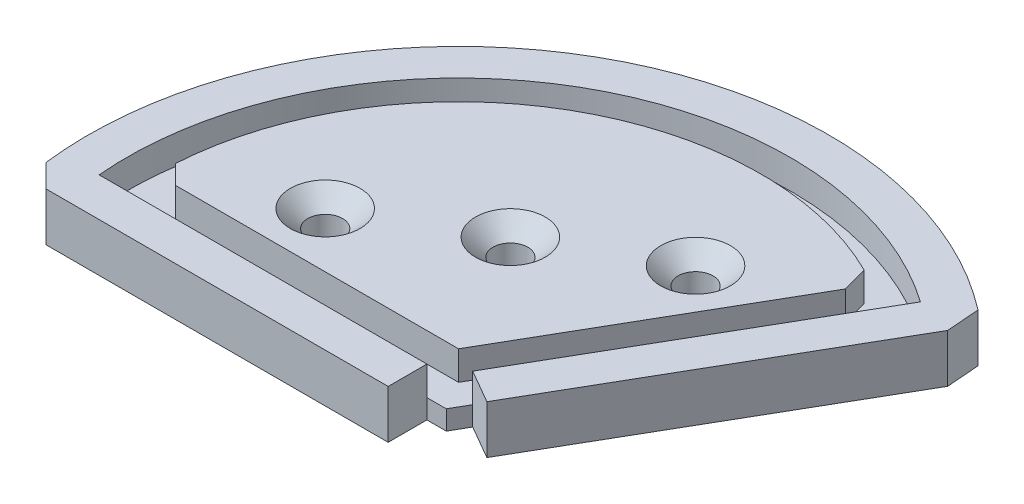
ISO-10303-21;
HEADER;
FILE_DESCRIPTION(('STEP AP214'),'2;1');
FILE_NAME('part.step','',(''),(''),'','','');
FILE_SCHEMA(('AUTOMOTIVE_DESIGN { 1 0 10303 214 1 1 1 1 }'));
ENDSEC;
DATA;
#1=APPLICATION_CONTEXT('core data for automotive mechanical design processes');
#2=APPLICATION_PROTOCOL_DEFINITION('international standard','automotive_design',2000,#1);
#3=PRODUCT_CONTEXT('',#1,'mechanical');
#4=PRODUCT('Part','Part','',(#3));
#5=PRODUCT_RELATED_PRODUCT_CATEGORY('part','',(#4));
#6=PRODUCT_DEFINITION_FORMATION('','',#4);
#7=PRODUCT_DEFINITION_CONTEXT('part definition',#1,'design');
#8=PRODUCT_DEFINITION('design','',#6,#7);
#9=PRODUCT_DEFINITION_SHAPE('','',#8);
#10=(LENGTH_UNIT() NAMED_UNIT(*) SI_UNIT(.MILLI.,.METRE.));
#11=(NAMED_UNIT(*) PLANE_ANGLE_UNIT() SI_UNIT($,.RADIAN.));
#12=(NAMED_UNIT(*) SI_UNIT($,.STERADIAN.) SOLID_ANGLE_UNIT());
#13=UNCERTAINTY_MEASURE_WITH_UNIT(LENGTH_MEASURE(1.E-05),#10,'distance_accuracy_value','');
#14=(GEOMETRIC_REPRESENTATION_CONTEXT(3) GLOBAL_UNCERTAINTY_ASSIGNED_CONTEXT((#13)) GLOBAL_UNIT_ASSIGNED_CONTEXT((#10,
#11,#12)) REPRESENTATION_CONTEXT('',''));
#15=CARTESIAN_POINT('',(0.,0.,0.));
#16=DIRECTION('',(0.,0.,1.));
#17=DIRECTION('',(1.,0.,0.));
#18=AXIS2_PLACEMENT_3D('',#15,#16,#17);
#19=CARTESIAN_POINT('',(0.,-1.,0.));
#20=DIRECTION('',(0.,-1.,0.));
#21=DIRECTION('',(0.,0.,-1.));
#22=AXIS2_PLACEMENT_3D('',#19,#20,#21);
#23=PLANE('',#22);
#24=CARTESIAN_POINT('',(-9.71842782649105,-1.,-2.8328107651737));
#25=DIRECTION('',(0.,-1.,0.));
#26=DIRECTION('',(0.,0.,-1.));
#27=AXIS2_PLACEMENT_3D('',#24,#25,#26);
#28=CIRCLE('',#27,0.899999999999999);
#29=CARTESIAN_POINT('',(-9.71842782649105,-1.,-3.7328107651737));
#30=VERTEX_POINT('',#29);
#31=EDGE_CURVE('E548',#30,#30,#28,.F.);
#32=ORIENTED_EDGE('',*,*,#31,.T.);
#33=EDGE_LOOP('',(#32));
#34=FACE_BOUND('',#33,.T.);
#35=CARTESIAN_POINT('',(-3.65624999999998,-1.,-6.33281076517369));
#36=DIRECTION('',(0.,-1.,0.));
#37=DIRECTION('',(0.,0.,-1.));
#38=AXIS2_PLACEMENT_3D('',#35,#36,#37);
#39=CIRCLE('',#38,0.899999999999999);
#40=CARTESIAN_POINT('',(-3.65624999999998,-1.,-7.23281076517368));
#41=VERTEX_POINT('',#40);
#42=EDGE_CURVE('E227',#41,#41,#39,.F.);
#43=ORIENTED_EDGE('',*,*,#42,.T.);
#44=EDGE_LOOP('',(#43));
#45=FACE_BOUND('',#44,.T.);
#46=CARTESIAN_POINT('',(0.,-1.,0.));
#47=DIRECTION('',(0.,-1.,0.));
#48=DIRECTION('',(0.,0.,-1.));
#49=AXIS2_PLACEMENT_3D('',#46,#47,#48);
#50=CIRCLE('',#49,19.125);
#51=CARTESIAN_POINT('',(-18.9840057931438,-1.,2.31800540247032));
#52=VERTEX_POINT('',#51);
#53=CARTESIAN_POINT('',(11.6749307019114,-1.,-15.1479905632915));
#54=VERTEX_POINT('',#53);
#55=EDGE_CURVE('E298',#52,#54,#50,.T.);
#56=ORIENTED_EDGE('',*,*,#55,.T.);
#57=DIRECTION('',(-0.0776772910663522,0.,-0.996978554660326));
#58=VECTOR('',#57,1.);
#59=CARTESIAN_POINT('',(12.7775866276491,-1.,-0.995536274037095));
#60=LINE('',#59,#58);
#61=CARTESIAN_POINT('',(11.8071766569381,-1.,-13.4506298637579));
#62=VERTEX_POINT('',#61);
#63=EDGE_CURVE('E79',#54,#62,#60,.F.);
#64=ORIENTED_EDGE('',*,*,#63,.T.);
#65=DIRECTION('',(-0.500000000000004,0.,0.866025403784437));
#66=VECTOR('',#65,1.);
#67=CARTESIAN_POINT('',(3.03108891324553,-1.,1.75000000000001));
#68=LINE('',#67,#66);
#69=CARTESIAN_POINT('',(3.09807621135331,-1.,1.63397459621556));
#70=VERTEX_POINT('',#69);
#71=EDGE_CURVE('E301',#62,#70,#68,.T.);
#72=ORIENTED_EDGE('',*,*,#71,.T.);
#73=DIRECTION('',(-0.866025403784439,0.,-0.5));
#74=VECTOR('',#73,1.);
#75=CARTESIAN_POINT('',(1.36602540378443,-1.,0.633974596215562));
#76=LINE('',#75,#74);
#77=CARTESIAN_POINT('',(1.36602540378443,-1.,0.633974596215562));
#78=VERTEX_POINT('',#77);
#79=EDGE_CURVE('E214',#70,#78,#76,.T.);
#80=ORIENTED_EDGE('',*,*,#79,.T.);
#81=DIRECTION('',(-0.5,0.,0.866025403784439));
#82=VECTOR('',#81,1.);
#83=CARTESIAN_POINT('',(0.866025403784433,-1.,1.5));
#84=LINE('',#83,#82);
#85=CARTESIAN_POINT('',(0.866025403784433,-1.,1.5));
#86=VERTEX_POINT('',#85);
#87=EDGE_CURVE('E219',#78,#86,#84,.T.);
#88=ORIENTED_EDGE('',*,*,#87,.T.);
#89=DIRECTION('',(-1.,0.,0.));
#90=VECTOR('',#89,1.);
#91=CARTESIAN_POINT('',(-0.133974596215565,-1.,1.5));
#92=LINE('',#91,#90);
#93=CARTESIAN_POINT('',(-0.133974596215565,-1.,1.5));
#94=VERTEX_POINT('',#93);
#95=EDGE_CURVE('E197',#86,#94,#92,.T.);
#96=ORIENTED_EDGE('',*,*,#95,.T.);
#97=DIRECTION('',(0.,0.,1.));
#98=VECTOR('',#97,1.);
#99=CARTESIAN_POINT('',(-0.133974596215565,-1.,1.5));
#100=LINE('',#99,#98);
#101=CARTESIAN_POINT('',(-0.133974596215565,-1.,3.5));
#102=VERTEX_POINT('',#101);
#103=EDGE_CURVE('E208',#94,#102,#100,.T.);
#104=ORIENTED_EDGE('',*,*,#103,.T.);
#105=DIRECTION('',(-1.,0.,0.));
#106=VECTOR('',#105,1.);
#107=CARTESIAN_POINT('',(0.,-1.,3.5));
#108=LINE('',#107,#106);
#109=CARTESIAN_POINT('',(-17.8020111956141,-1.,3.5));
#110=VERTEX_POINT('',#109);
#111=EDGE_CURVE('E295',#102,#110,#108,.T.);
#112=ORIENTED_EDGE('',*,*,#111,.T.);
#113=DIRECTION('',(0.707106781186549,0.,0.707106781186546));
#114=VECTOR('',#113,1.);
#115=CARTESIAN_POINT('',(-10.651005597807,-1.,10.6510055978071));
#116=LINE('',#115,#114);
#117=EDGE_CURVE('E372',#110,#52,#116,.F.);
#118=ORIENTED_EDGE('',*,*,#117,.T.);
#119=EDGE_LOOP('',(#56,#64,#72,#80,#88,#96,#104,#112,#118));
#120=FACE_BOUND('',#119,.T.);
#121=CARTESIAN_POINT('',(2.40592782649111,-1.,-9.83281076517367));
#122=DIRECTION('',(0.,-1.,0.));
#123=DIRECTION('',(0.,0.,-1.));
#124=AXIS2_PLACEMENT_3D('',#121,#122,#123);
#125=CIRCLE('',#124,0.899999999999999);
#126=CARTESIAN_POINT('',(2.40592782649111,-1.,-10.7328107651737));
#127=VERTEX_POINT('',#126);
#128=EDGE_CURVE('E536',#127,#127,#125,.F.);
#129=ORIENTED_EDGE('',*,*,#128,.T.);
#130=EDGE_LOOP('',(#129));
#131=FACE_BOUND('',#130,.T.);
#132=ADVANCED_FACE('F69',(#34,#45,#120,#131),#23,.T.);
#133=CARTESIAN_POINT('',(0.,0.,0.));
#134=DIRECTION('',(0.,-1.,0.));
#135=DIRECTION('',(0.,0.,-1.));
#136=AXIS2_PLACEMENT_3D('',#133,#134,#135);
#137=PLANE('',#136);
#138=DIRECTION('',(0.500000000000004,0.,-0.866025403784436));
#139=VECTOR('',#138,1.);
#140=CARTESIAN_POINT('',(0.,0.,0.));
#141=LINE('',#140,#139);
#142=CARTESIAN_POINT('',(0.,0.,0.));
#143=VERTEX_POINT('',#142);
#144=CARTESIAN_POINT('',(7.31250000000005,0.,-12.6656215303474));
#145=VERTEX_POINT('',#144);
#146=EDGE_CURVE('E304',#143,#145,#141,.T.);
#147=ORIENTED_EDGE('',*,*,#146,.F.);
#148=DIRECTION('',(1.,0.,0.));
#149=VECTOR('',#148,1.);
#150=CARTESIAN_POINT('',(0.,0.,0.));
#151=LINE('',#150,#149);
#152=CARTESIAN_POINT('',(-14.625,0.,0.));
#153=VERTEX_POINT('',#152);
#154=EDGE_CURVE('E310',#153,#143,#151,.T.);
#155=ORIENTED_EDGE('',*,*,#154,.F.);
#156=DIRECTION('',(0.707106781186545,0.,0.70710678118655));
#157=VECTOR('',#156,1.);
#158=CARTESIAN_POINT('',(-7.31250000000006,0.,7.3125));
#159=LINE('',#158,#157);
#160=CARTESIAN_POINT('',(-15.5948702072535,0.,-0.969870207253476));
#161=VERTEX_POINT('',#160);
#162=EDGE_CURVE('E353',#153,#161,#159,.F.);
#163=ORIENTED_EDGE('',*,*,#162,.T.);
#164=CARTESIAN_POINT('',(0.,0.,0.));
#165=DIRECTION('',(0.,1.,0.));
#166=DIRECTION('',(0.,0.,1.));
#167=AXIS2_PLACEMENT_3D('',#164,#165,#166);
#168=CIRCLE('',#167,15.625);
#169=CARTESIAN_POINT('',(6.9575028657716,0.,-13.9904888718293));
#170=VERTEX_POINT('',#169);
#171=EDGE_CURVE('E321',#170,#161,#168,.T.);
#172=ORIENTED_EDGE('',*,*,#171,.F.);
#173=DIRECTION('',(-0.258819045102515,0.,-0.96592582628907));
#174=VECTOR('',#173,1.);
#175=CARTESIAN_POINT('',(9.9890607651737,0.,-2.67656076517364));
#176=LINE('',#175,#174);
#177=EDGE_CURVE('E350',#170,#145,#176,.F.);
#178=ORIENTED_EDGE('',*,*,#177,.T.);
#179=EDGE_LOOP('',(#147,#155,#163,#172,#178));
#180=FACE_BOUND('',#179,.T.);
#181=DIRECTION('',(1.,0.,0.));
#182=VECTOR('',#181,1.);
#183=CARTESIAN_POINT('',(0.,0.,1.5));
#184=LINE('',#183,#182);
#185=CARTESIAN_POINT('',(-17.0591800799452,0.,1.5));
#186=VERTEX_POINT('',#185);
#187=CARTESIAN_POINT('',(-0.133974596215565,0.,1.5));
#188=VERTEX_POINT('',#187);
#189=EDGE_CURVE('E275',#186,#188,#184,.T.);
#190=ORIENTED_EDGE('',*,*,#189,.T.);
#191=DIRECTION('',(1.,0.,0.));
#192=VECTOR('',#191,1.);
#193=CARTESIAN_POINT('',(0.,0.,1.5));
#194=LINE('',#193,#192);
#195=CARTESIAN_POINT('',(0.866025403784433,0.,1.5));
#196=VERTEX_POINT('',#195);
#197=EDGE_CURVE('E200',#188,#196,#194,.T.);
#198=ORIENTED_EDGE('',*,*,#197,.T.);
#199=DIRECTION('',(0.500000000000004,0.,-0.866025403784437));
#200=VECTOR('',#199,1.);
#201=CARTESIAN_POINT('',(1.29903810567665,0.,0.750000000000005));
#202=LINE('',#201,#200);
#203=CARTESIAN_POINT('',(1.36602540378443,0.,0.633974596215562));
#204=VERTEX_POINT('',#203);
#205=EDGE_CURVE('E280',#196,#204,#202,.T.);
#206=ORIENTED_EDGE('',*,*,#205,.T.);
#207=CARTESIAN_POINT('',(9.82862814564933,0.,-14.023683316966));
#208=VERTEX_POINT('',#207);
#209=EDGE_CURVE('E279',#204,#208,#202,.T.);
#210=ORIENTED_EDGE('',*,*,#209,.T.);
#211=CARTESIAN_POINT('',(0.,0.,0.));
#212=DIRECTION('',(0.,1.,0.));
#213=DIRECTION('',(0.,0.,1.));
#214=AXIS2_PLACEMENT_3D('',#211,#212,#213);
#215=CIRCLE('',#214,17.125);
#216=EDGE_CURVE('E271',#208,#186,#215,.T.);
#217=ORIENTED_EDGE('',*,*,#216,.T.);
#218=EDGE_LOOP('',(#190,#198,#206,#210,#217));
#219=FACE_BOUND('',#218,.T.);
#220=ADVANCED_FACE('F409',(#180,#219),#137,.F.);
#221=CARTESIAN_POINT('',(0.,1.5,0.));
#222=DIRECTION('',(-0.866025403784436,0.,-0.500000000000004));
#223=DIRECTION('',(-0.500000000000004,0.,0.866025403784436));
#224=AXIS2_PLACEMENT_3D('',#221,#222,#223);
#225=PLANE('',#224);
#226=ORIENTED_EDGE('',*,*,#146,.T.);
#227=DIRECTION('',(0.,1.,0.));
#228=VECTOR('',#227,1.);
#229=CARTESIAN_POINT('',(7.31250000000005,1.5,-12.6656215303474));
#230=LINE('',#229,#228);
#231=CARTESIAN_POINT('',(7.31250000000005,1.5,-12.6656215303474));
#232=VERTEX_POINT('',#231);
#233=EDGE_CURVE('E337',#145,#232,#230,.T.);
#234=ORIENTED_EDGE('',*,*,#233,.T.);
#235=DIRECTION('',(0.500000000000004,0.,-0.866025403784436));
#236=VECTOR('',#235,1.);
#237=CARTESIAN_POINT('',(0.,1.5,0.));
#238=LINE('',#237,#236);
#239=CARTESIAN_POINT('',(0.,1.5,0.));
#240=VERTEX_POINT('',#239);
#241=EDGE_CURVE('E305',#240,#232,#238,.T.);
#242=ORIENTED_EDGE('',*,*,#241,.F.);
#243=DIRECTION('',(0.,-1.,0.));
#244=VECTOR('',#243,1.);
#245=CARTESIAN_POINT('',(0.,1.5,0.));
#246=LINE('',#245,#244);
#247=EDGE_CURVE('E317',#240,#143,#246,.T.);
#248=ORIENTED_EDGE('',*,*,#247,.T.);
#249=EDGE_LOOP('',(#226,#234,#242,#248));
#250=FACE_BOUND('',#249,.T.);
#251=ADVANCED_FACE('F417',(#250),#225,.F.);
#252=CARTESIAN_POINT('',(0.,1.5,0.));
#253=DIRECTION('',(0.,-1.,0.));
#254=DIRECTION('',(0.,0.,-1.));
#255=AXIS2_PLACEMENT_3D('',#252,#253,#254);
#256=CYLINDRICAL_SURFACE('',#255,15.625);
#257=CARTESIAN_POINT('',(0.,1.5,0.));
#258=DIRECTION('',(0.,1.,0.));
#259=DIRECTION('',(0.,0.,1.));
#260=AXIS2_PLACEMENT_3D('',#257,#258,#259);
#261=CIRCLE('',#260,15.625);
#262=CARTESIAN_POINT('',(6.9575028657716,1.5,-13.9904888718293));
#263=VERTEX_POINT('',#262);
#264=CARTESIAN_POINT('',(-15.5948702072535,1.5,-0.969870207253476));
#265=VERTEX_POINT('',#264);
#266=EDGE_CURVE('E309',#263,#265,#261,.T.);
#267=ORIENTED_EDGE('',*,*,#266,.F.);
#268=DIRECTION('',(0.,-1.,0.));
#269=VECTOR('',#268,1.);
#270=CARTESIAN_POINT('',(6.9575028657716,1.5,-13.9904888718293));
#271=LINE('',#270,#269);
#272=EDGE_CURVE('E333',#263,#170,#271,.T.);
#273=ORIENTED_EDGE('',*,*,#272,.T.);
#274=ORIENTED_EDGE('',*,*,#171,.T.);
#275=DIRECTION('',(0.,-1.,0.));
#276=VECTOR('',#275,1.);
#277=CARTESIAN_POINT('',(-15.5948702072535,1.5,-0.969870207253476));
#278=LINE('',#277,#276);
#279=EDGE_CURVE('E330',#161,#265,#278,.F.);
#280=ORIENTED_EDGE('',*,*,#279,.T.);
#281=EDGE_LOOP('',(#267,#273,#274,#280));
#282=FACE_BOUND('',#281,.T.);
#283=ADVANCED_FACE('F492',(#282),#256,.T.);
#284=CARTESIAN_POINT('',(0.,1.5,0.));
#285=DIRECTION('',(0.,0.,-1.));
#286=DIRECTION('',(-1.,0.,0.));
#287=AXIS2_PLACEMENT_3D('',#284,#285,#286);
#288=PLANE('',#287);
#289=DIRECTION('',(1.,0.,0.));
#290=VECTOR('',#289,1.);
#291=CARTESIAN_POINT('',(0.,1.5,0.));
#292=LINE('',#291,#290);
#293=CARTESIAN_POINT('',(-14.625,1.5,0.));
#294=VERTEX_POINT('',#293);
#295=EDGE_CURVE('E314',#294,#240,#292,.T.);
#296=ORIENTED_EDGE('',*,*,#295,.F.);
#297=DIRECTION('',(0.,-1.,0.));
#298=VECTOR('',#297,1.);
#299=CARTESIAN_POINT('',(-14.625,1.5,0.));
#300=LINE('',#299,#298);
#301=EDGE_CURVE('E346',#294,#153,#300,.T.);
#302=ORIENTED_EDGE('',*,*,#301,.T.);
#303=ORIENTED_EDGE('',*,*,#154,.T.);
#304=ORIENTED_EDGE('',*,*,#247,.F.);
#305=EDGE_LOOP('',(#296,#302,#303,#304));
#306=FACE_BOUND('',#305,.T.);
#307=ADVANCED_FACE('F496',(#306),#288,.F.);
#308=CARTESIAN_POINT('',(0.,1.5,0.));
#309=DIRECTION('',(0.,1.,0.));
#310=DIRECTION('',(0.,0.,1.));
#311=AXIS2_PLACEMENT_3D('',#308,#309,#310);
#312=PLANE('',#311);
#313=CARTESIAN_POINT('',(-9.71842782649105,1.5,-2.8328107651737));
#314=DIRECTION('',(0.,1.,0.));
#315=DIRECTION('',(0.,0.,1.));
#316=AXIS2_PLACEMENT_3D('',#313,#314,#315);
#317=CIRCLE('',#316,1.8);
#318=CARTESIAN_POINT('',(-9.71842782649105,1.5,-1.0328107651737));
#319=VERTEX_POINT('',#318);
#320=EDGE_CURVE('E507',#319,#319,#317,.T.);
#321=ORIENTED_EDGE('',*,*,#320,.F.);
#322=EDGE_LOOP('',(#321));
#323=FACE_BOUND('',#322,.T.);
#324=CARTESIAN_POINT('',(2.40592782649111,1.5,-9.83281076517367));
#325=DIRECTION('',(0.,1.,0.));
#326=DIRECTION('',(0.,0.,1.));
#327=AXIS2_PLACEMENT_3D('',#324,#325,#326);
#328=CIRCLE('',#327,1.8);
#329=CARTESIAN_POINT('',(2.40592782649111,1.5,-8.03281076517367));
#330=VERTEX_POINT('',#329);
#331=EDGE_CURVE('E511',#330,#330,#328,.T.);
#332=ORIENTED_EDGE('',*,*,#331,.F.);
#333=EDGE_LOOP('',(#332));
#334=FACE_BOUND('',#333,.T.);
#335=CARTESIAN_POINT('',(-3.65624999999998,1.5,-6.33281076517369));
#336=DIRECTION('',(0.,1.,0.));
#337=DIRECTION('',(0.,0.,1.));
#338=AXIS2_PLACEMENT_3D('',#335,#336,#337);
#339=CIRCLE('',#338,1.8);
#340=CARTESIAN_POINT('',(-3.65624999999998,1.5,-4.53281076517368));
#341=VERTEX_POINT('',#340);
#342=EDGE_CURVE('E515',#341,#341,#339,.T.);
#343=ORIENTED_EDGE('',*,*,#342,.F.);
#344=EDGE_LOOP('',(#343));
#345=FACE_BOUND('',#344,.T.);
#346=ORIENTED_EDGE('',*,*,#241,.T.);
#347=DIRECTION('',(0.258819045102515,0.,0.96592582628907));
#348=VECTOR('',#347,1.);
#349=CARTESIAN_POINT('',(9.9890607651737,1.5,-2.67656076517364));
#350=LINE('',#349,#348);
#351=EDGE_CURVE('E343',#232,#263,#350,.F.);
#352=ORIENTED_EDGE('',*,*,#351,.T.);
#353=ORIENTED_EDGE('',*,*,#266,.T.);
#354=DIRECTION('',(-0.707106781186545,0.,-0.70710678118655));
#355=VECTOR('',#354,1.);
#356=CARTESIAN_POINT('',(-7.31250000000006,1.5,7.3125));
#357=LINE('',#356,#355);
#358=EDGE_CURVE('E340',#265,#294,#357,.F.);
#359=ORIENTED_EDGE('',*,*,#358,.T.);
#360=ORIENTED_EDGE('',*,*,#295,.T.);
#361=EDGE_LOOP('',(#346,#352,#353,#359,#360));
#362=FACE_BOUND('',#361,.T.);
#363=ADVANCED_FACE('F441',(#323,#334,#345,#362),#312,.T.);
#364=CARTESIAN_POINT('',(1.29903810567665,40.3296386666102,0.750000000000005));
#365=DIRECTION('',(-0.866025403784436,0.,-0.500000000000004));
#366=DIRECTION('',(-0.500000000000004,0.,0.866025403784437));
#367=AXIS2_PLACEMENT_3D('',#364,#365,#366);
#368=PLANE('',#367);
#369=DIRECTION('',(0.,1.,0.));
#370=VECTOR('',#369,1.);
#371=CARTESIAN_POINT('',(1.36602540378443,-1.,0.633974596215562));
#372=LINE('',#371,#370);
#373=CARTESIAN_POINT('',(1.36602540378443,1.5,0.633974596215562));
#374=VERTEX_POINT('',#373);
#375=EDGE_CURVE('E244',#204,#374,#372,.T.);
#376=ORIENTED_EDGE('',*,*,#375,.T.);
#377=DIRECTION('',(0.500000000000004,0.,-0.866025403784437));
#378=VECTOR('',#377,1.);
#379=CARTESIAN_POINT('',(1.29903810567665,1.5,0.750000000000005));
#380=LINE('',#379,#378);
#381=CARTESIAN_POINT('',(9.82862814564933,1.5,-14.023683316966));
#382=VERTEX_POINT('',#381);
#383=EDGE_CURVE('E292',#374,#382,#380,.T.);
#384=ORIENTED_EDGE('',*,*,#383,.T.);
#385=DIRECTION('',(0.,-1.,0.));
#386=VECTOR('',#385,1.);
#387=CARTESIAN_POINT('',(9.82862814564933,40.3296386666102,-14.023683316966));
#388=LINE('',#387,#386);
#389=EDGE_CURVE('E284',#382,#208,#388,.T.);
#390=ORIENTED_EDGE('',*,*,#389,.T.);
#391=ORIENTED_EDGE('',*,*,#209,.F.);
#392=EDGE_LOOP('',(#376,#384,#390,#391));
#393=FACE_BOUND('',#392,.T.);
#394=ADVANCED_FACE('F439',(#393),#368,.T.);
#395=CARTESIAN_POINT('',(0.,40.3296386666102,1.5));
#396=DIRECTION('',(0.,0.,-1.));
#397=DIRECTION('',(-1.,0.,0.));
#398=AXIS2_PLACEMENT_3D('',#395,#396,#397);
#399=PLANE('',#398);
#400=DIRECTION('',(0.,1.,0.));
#401=VECTOR('',#400,1.);
#402=CARTESIAN_POINT('',(-0.133974596215565,-1.,1.5));
#403=LINE('',#402,#401);
#404=CARTESIAN_POINT('',(-0.133974596215565,1.5,1.5));
#405=VERTEX_POINT('',#404);
#406=EDGE_CURVE('E205',#188,#405,#403,.T.);
#407=ORIENTED_EDGE('',*,*,#406,.F.);
#408=ORIENTED_EDGE('',*,*,#189,.F.);
#409=DIRECTION('',(0.,-1.,0.));
#410=VECTOR('',#409,1.);
#411=CARTESIAN_POINT('',(-17.0591800799452,40.3296386666102,1.5));
#412=LINE('',#411,#410);
#413=CARTESIAN_POINT('',(-17.0591800799452,1.5,1.5));
#414=VERTEX_POINT('',#413);
#415=EDGE_CURVE('E288',#414,#186,#412,.T.);
#416=ORIENTED_EDGE('',*,*,#415,.F.);
#417=DIRECTION('',(1.,0.,0.));
#418=VECTOR('',#417,1.);
#419=CARTESIAN_POINT('',(0.,1.5,1.5));
#420=LINE('',#419,#418);
#421=EDGE_CURVE('E252',#414,#405,#420,.T.);
#422=ORIENTED_EDGE('',*,*,#421,.T.);
#423=EDGE_LOOP('',(#407,#408,#416,#422));
#424=FACE_BOUND('',#423,.T.);
#425=ADVANCED_FACE('F434',(#424),#399,.T.);
#426=CARTESIAN_POINT('',(0.,40.3296386666102,0.));
#427=DIRECTION('',(0.,-1.,0.));
#428=DIRECTION('',(0.,0.,-1.));
#429=AXIS2_PLACEMENT_3D('',#426,#427,#428);
#430=CYLINDRICAL_SURFACE('',#429,17.125);
#431=ORIENTED_EDGE('',*,*,#389,.F.);
#432=CARTESIAN_POINT('',(0.,1.5,0.));
#433=DIRECTION('',(0.,1.,0.));
#434=DIRECTION('',(0.,0.,1.));
#435=AXIS2_PLACEMENT_3D('',#432,#433,#434);
#436=CIRCLE('',#435,17.125);
#437=EDGE_CURVE('E256',#382,#414,#436,.T.);
#438=ORIENTED_EDGE('',*,*,#437,.T.);
#439=ORIENTED_EDGE('',*,*,#415,.T.);
#440=ORIENTED_EDGE('',*,*,#216,.F.);
#441=EDGE_LOOP('',(#431,#438,#439,#440));
#442=FACE_BOUND('',#441,.T.);
#443=ADVANCED_FACE('F423',(#442),#430,.F.);
#444=CARTESIAN_POINT('',(0.,1.5,0.));
#445=DIRECTION('',(0.,1.,0.));
#446=DIRECTION('',(0.,0.,1.));
#447=AXIS2_PLACEMENT_3D('',#444,#445,#446);
#448=PLANE('',#447);
#449=DIRECTION('',(0.500000000000004,0.,-0.866025403784437));
#450=VECTOR('',#449,1.);
#451=CARTESIAN_POINT('',(3.03108891324553,1.5,1.75000000000001));
#452=LINE('',#451,#450);
#453=CARTESIAN_POINT('',(3.09807621135331,1.5,1.63397459621556));
#454=VERTEX_POINT('',#453);
#455=CARTESIAN_POINT('',(11.8071766569381,1.5,-13.4506298637579));
#456=VERTEX_POINT('',#455);
#457=EDGE_CURVE('E260',#454,#456,#452,.T.);
#458=ORIENTED_EDGE('',*,*,#457,.T.);
#459=DIRECTION('',(0.0776772910663522,0.,0.996978554660326));
#460=VECTOR('',#459,1.);
#461=CARTESIAN_POINT('',(12.7775866276491,1.5,-0.995536274037095));
#462=LINE('',#461,#460);
#463=CARTESIAN_POINT('',(11.6749307019114,1.5,-15.1479905632915));
#464=VERTEX_POINT('',#463);
#465=EDGE_CURVE('E363',#456,#464,#462,.F.);
#466=ORIENTED_EDGE('',*,*,#465,.T.);
#467=CARTESIAN_POINT('',(0.,1.5,0.));
#468=DIRECTION('',(0.,1.,0.));
#469=DIRECTION('',(0.,0.,1.));
#470=AXIS2_PLACEMENT_3D('',#467,#468,#469);
#471=CIRCLE('',#470,19.125);
#472=CARTESIAN_POINT('',(-18.9840057931438,1.5,2.31800540247032));
#473=VERTEX_POINT('',#472);
#474=EDGE_CURVE('E267',#464,#473,#471,.T.);
#475=ORIENTED_EDGE('',*,*,#474,.T.);
#476=DIRECTION('',(-0.707106781186549,0.,-0.707106781186546));
#477=VECTOR('',#476,1.);
#478=CARTESIAN_POINT('',(-10.651005597807,1.5,10.6510055978071));
#479=LINE('',#478,#477);
#480=CARTESIAN_POINT('',(-17.8020111956141,1.5,3.5));
#481=VERTEX_POINT('',#480);
#482=EDGE_CURVE('E360',#473,#481,#479,.F.);
#483=ORIENTED_EDGE('',*,*,#482,.T.);
#484=DIRECTION('',(1.,0.,0.));
#485=VECTOR('',#484,1.);
#486=CARTESIAN_POINT('',(0.,1.5,3.5));
#487=LINE('',#486,#485);
#488=CARTESIAN_POINT('',(-0.133974596215565,1.5,3.5));
#489=VERTEX_POINT('',#488);
#490=EDGE_CURVE('E264',#481,#489,#487,.T.);
#491=ORIENTED_EDGE('',*,*,#490,.T.);
#492=DIRECTION('',(0.,0.,1.));
#493=VECTOR('',#492,1.);
#494=CARTESIAN_POINT('',(-0.133974596215565,1.5,1.5));
#495=LINE('',#494,#493);
#496=EDGE_CURVE('E224',#405,#489,#495,.T.);
#497=ORIENTED_EDGE('',*,*,#496,.F.);
#498=ORIENTED_EDGE('',*,*,#421,.F.);
#499=ORIENTED_EDGE('',*,*,#437,.F.);
#500=ORIENTED_EDGE('',*,*,#383,.F.);
#501=DIRECTION('',(-0.866025403784439,0.,-0.5));
#502=VECTOR('',#501,1.);
#503=CARTESIAN_POINT('',(1.36602540378443,1.5,0.633974596215562));
#504=LINE('',#503,#502);
#505=EDGE_CURVE('E221',#454,#374,#504,.T.);
#506=ORIENTED_EDGE('',*,*,#505,.F.);
#507=EDGE_LOOP('',(#458,#466,#475,#483,#491,#497,#498,#499,#500,#506));
#508=FACE_BOUND('',#507,.T.);
#509=ADVANCED_FACE('F386',(#508),#448,.T.);
#510=CARTESIAN_POINT('',(0.,-1.,0.));
#511=DIRECTION('',(0.,1.,0.));
#512=DIRECTION('',(0.,0.,1.));
#513=AXIS2_PLACEMENT_3D('',#510,#511,#512);
#514=CYLINDRICAL_SURFACE('',#513,19.125);
#515=ORIENTED_EDGE('',*,*,#474,.F.);
#516=DIRECTION('',(0.,1.,0.));
#517=VECTOR('',#516,1.);
#518=CARTESIAN_POINT('',(11.6749307019114,-1.,-15.1479905632915));
#519=LINE('',#518,#517);
#520=EDGE_CURVE('E92',#464,#54,#519,.F.);
#521=ORIENTED_EDGE('',*,*,#520,.T.);
#522=ORIENTED_EDGE('',*,*,#55,.F.);
#523=DIRECTION('',(0.,1.,0.));
#524=VECTOR('',#523,1.);
#525=CARTESIAN_POINT('',(-18.9840057931438,-1.,2.31800540247032));
#526=LINE('',#525,#524);
#527=EDGE_CURVE('E366',#52,#473,#526,.T.);
#528=ORIENTED_EDGE('',*,*,#527,.T.);
#529=EDGE_LOOP('',(#515,#521,#522,#528));
#530=FACE_BOUND('',#529,.T.);
#531=ADVANCED_FACE('F388',(#530),#514,.T.);
#532=CARTESIAN_POINT('',(3.03108891324553,-1.,1.75000000000001));
#533=DIRECTION('',(-0.866025403784437,0.,-0.500000000000004));
#534=DIRECTION('',(-0.500000000000004,0.,0.866025403784437));
#535=AXIS2_PLACEMENT_3D('',#532,#533,#534);
#536=PLANE('',#535);
#537=ORIENTED_EDGE('',*,*,#71,.F.);
#538=DIRECTION('',(0.,1.,0.));
#539=VECTOR('',#538,1.);
#540=CARTESIAN_POINT('',(11.8071766569381,-1.,-13.4506298637579));
#541=LINE('',#540,#539);
#542=EDGE_CURVE('E356',#62,#456,#541,.T.);
#543=ORIENTED_EDGE('',*,*,#542,.T.);
#544=ORIENTED_EDGE('',*,*,#457,.F.);
#545=DIRECTION('',(0.,1.,0.));
#546=VECTOR('',#545,1.);
#547=CARTESIAN_POINT('',(3.09807621135331,-1.,1.63397459621556));
#548=LINE('',#547,#546);
#549=EDGE_CURVE('E245',#70,#454,#548,.T.);
#550=ORIENTED_EDGE('',*,*,#549,.F.);
#551=EDGE_LOOP('',(#537,#543,#544,#550));
#552=FACE_BOUND('',#551,.T.);
#553=ADVANCED_FACE('F382',(#552),#536,.F.);
#554=CARTESIAN_POINT('',(0.,-1.,3.5));
#555=DIRECTION('',(0.,0.,-1.));
#556=DIRECTION('',(-1.,0.,0.));
#557=AXIS2_PLACEMENT_3D('',#554,#555,#556);
#558=PLANE('',#557);
#559=ORIENTED_EDGE('',*,*,#490,.F.);
#560=DIRECTION('',(0.,-1.,0.));
#561=VECTOR('',#560,1.);
#562=CARTESIAN_POINT('',(-17.8020111956141,-1.,3.5));
#563=LINE('',#562,#561);
#564=EDGE_CURVE('E12',#481,#110,#563,.T.);
#565=ORIENTED_EDGE('',*,*,#564,.T.);
#566=ORIENTED_EDGE('',*,*,#111,.F.);
#567=DIRECTION('',(0.,1.,0.));
#568=VECTOR('',#567,1.);
#569=CARTESIAN_POINT('',(-0.133974596215565,-1.,3.5));
#570=LINE('',#569,#568);
#571=EDGE_CURVE('E204',#102,#489,#570,.T.);
#572=ORIENTED_EDGE('',*,*,#571,.T.);
#573=EDGE_LOOP('',(#559,#565,#566,#572));
#574=FACE_BOUND('',#573,.T.);
#575=ADVANCED_FACE('F393',(#574),#558,.F.);
#576=CARTESIAN_POINT('',(6.9575028657716,1.5,-13.9904888718293));
#577=DIRECTION('',(-0.96592582628907,0.,0.258819045102515));
#578=DIRECTION('',(0.,-1.,0.));
#579=AXIS2_PLACEMENT_3D('',#576,#577,#578);
#580=PLANE('',#579);
#581=ORIENTED_EDGE('',*,*,#351,.F.);
#582=ORIENTED_EDGE('',*,*,#233,.F.);
#583=ORIENTED_EDGE('',*,*,#177,.F.);
#584=ORIENTED_EDGE('',*,*,#272,.F.);
#585=EDGE_LOOP('',(#581,#582,#583,#584));
#586=FACE_BOUND('',#585,.T.);
#587=ADVANCED_FACE('F395',(#586),#580,.F.);
#588=CARTESIAN_POINT('',(-14.625,1.5,0.));
#589=DIRECTION('',(0.70710678118655,0.,-0.707106781186545));
#590=DIRECTION('',(0.,-1.,0.));
#591=AXIS2_PLACEMENT_3D('',#588,#589,#590);
#592=PLANE('',#591);
#593=ORIENTED_EDGE('',*,*,#358,.F.);
#594=ORIENTED_EDGE('',*,*,#279,.F.);
#595=ORIENTED_EDGE('',*,*,#162,.F.);
#596=ORIENTED_EDGE('',*,*,#301,.F.);
#597=EDGE_LOOP('',(#593,#594,#595,#596));
#598=FACE_BOUND('',#597,.T.);
#599=ADVANCED_FACE('F402',(#598),#592,.F.);
#600=CARTESIAN_POINT('',(-0.133974596215565,-1.,1.5));
#601=DIRECTION('',(0.,0.,-1.));
#602=DIRECTION('',(-1.,0.,0.));
#603=AXIS2_PLACEMENT_3D('',#600,#601,#602);
#604=PLANE('',#603);
#605=EDGE_CURVE('E192',#94,#188,#403,.T.);
#606=ORIENTED_EDGE('',*,*,#605,.F.);
#607=ORIENTED_EDGE('',*,*,#95,.F.);
#608=DIRECTION('',(0.,1.,0.));
#609=VECTOR('',#608,1.);
#610=CARTESIAN_POINT('',(0.866025403784433,-1.,1.5));
#611=LINE('',#610,#609);
#612=EDGE_CURVE('E237',#86,#196,#611,.T.);
#613=ORIENTED_EDGE('',*,*,#612,.T.);
#614=ORIENTED_EDGE('',*,*,#197,.F.);
#615=EDGE_LOOP('',(#606,#607,#613,#614));
#616=FACE_BOUND('',#615,.T.);
#617=ADVANCED_FACE('F194',(#616),#604,.F.);
#618=CARTESIAN_POINT('',(0.866025403784433,-1.,1.5));
#619=DIRECTION('',(-0.866025403784439,0.,-0.5));
#620=DIRECTION('',(-0.5,0.,0.866025403784439));
#621=AXIS2_PLACEMENT_3D('',#618,#619,#620);
#622=PLANE('',#621);
#623=ORIENTED_EDGE('',*,*,#612,.F.);
#624=ORIENTED_EDGE('',*,*,#87,.F.);
#625=EDGE_CURVE('E240',#78,#204,#372,.T.);
#626=ORIENTED_EDGE('',*,*,#625,.T.);
#627=ORIENTED_EDGE('',*,*,#205,.F.);
#628=EDGE_LOOP('',(#623,#624,#626,#627));
#629=FACE_BOUND('',#628,.T.);
#630=ADVANCED_FACE('F462',(#629),#622,.F.);
#631=CARTESIAN_POINT('',(1.36602540378443,-1.,0.633974596215562));
#632=DIRECTION('',(0.5,0.,-0.866025403784439));
#633=DIRECTION('',(-0.866025403784439,0.,-0.5));
#634=AXIS2_PLACEMENT_3D('',#631,#632,#633);
#635=PLANE('',#634);
#636=ORIENTED_EDGE('',*,*,#505,.T.);
#637=ORIENTED_EDGE('',*,*,#375,.F.);
#638=ORIENTED_EDGE('',*,*,#625,.F.);
#639=ORIENTED_EDGE('',*,*,#79,.F.);
#640=ORIENTED_EDGE('',*,*,#549,.T.);
#641=EDGE_LOOP('',(#636,#637,#638,#639,#640));
#642=FACE_BOUND('',#641,.T.);
#643=ADVANCED_FACE('F460',(#642),#635,.F.);
#644=CARTESIAN_POINT('',(-0.133974596215565,-1.,1.5));
#645=DIRECTION('',(-1.,0.,0.));
#646=DIRECTION('',(0.,0.,1.));
#647=AXIS2_PLACEMENT_3D('',#644,#645,#646);
#648=PLANE('',#647);
#649=ORIENTED_EDGE('',*,*,#496,.T.);
#650=ORIENTED_EDGE('',*,*,#571,.F.);
#651=ORIENTED_EDGE('',*,*,#103,.F.);
#652=ORIENTED_EDGE('',*,*,#605,.T.);
#653=ORIENTED_EDGE('',*,*,#406,.T.);
#654=EDGE_LOOP('',(#649,#650,#651,#652,#653));
#655=FACE_BOUND('',#654,.T.);
#656=ADVANCED_FACE('F210',(#655),#648,.F.);
#657=CARTESIAN_POINT('',(11.8071766569381,-1.,-13.4506298637579));
#658=DIRECTION('',(-0.996978554660326,0.,0.0776772910663522));
#659=DIRECTION('',(0.,1.,0.));
#660=AXIS2_PLACEMENT_3D('',#657,#658,#659);
#661=PLANE('',#660);
#662=ORIENTED_EDGE('',*,*,#63,.F.);
#663=ORIENTED_EDGE('',*,*,#520,.F.);
#664=ORIENTED_EDGE('',*,*,#465,.F.);
#665=ORIENTED_EDGE('',*,*,#542,.F.);
#666=EDGE_LOOP('',(#662,#663,#664,#665));
#667=FACE_BOUND('',#666,.T.);
#668=ADVANCED_FACE('F384',(#667),#661,.F.);
#669=CARTESIAN_POINT('',(-18.9840057931438,-1.,2.31800540247032));
#670=DIRECTION('',(0.707106781186546,0.,-0.707106781186549));
#671=DIRECTION('',(0.,1.,0.));
#672=AXIS2_PLACEMENT_3D('',#669,#670,#671);
#673=PLANE('',#672);
#674=ORIENTED_EDGE('',*,*,#117,.F.);
#675=ORIENTED_EDGE('',*,*,#564,.F.);
#676=ORIENTED_EDGE('',*,*,#482,.F.);
#677=ORIENTED_EDGE('',*,*,#527,.F.);
#678=EDGE_LOOP('',(#674,#675,#676,#677));
#679=FACE_BOUND('',#678,.T.);
#680=ADVANCED_FACE('F72',(#679),#673,.F.);
#681=CARTESIAN_POINT('',(-3.65624999999998,1.5,-6.33281076517369));
#682=DIRECTION('',(0.,1.,0.));
#683=DIRECTION('',(0.,0.,1.));
#684=AXIS2_PLACEMENT_3D('',#681,#682,#683);
#685=CYLINDRICAL_SURFACE('',#684,0.899999999999999);
#686=ORIENTED_EDGE('',*,*,#42,.F.);
#687=EDGE_LOOP('',(#686));
#688=FACE_BOUND('',#687,.T.);
#689=CARTESIAN_POINT('',(-3.65624999999998,0.599999999999997,-6.33281076517369));
#690=DIRECTION('',(0.,1.,0.));
#691=DIRECTION('',(0.,0.,1.));
#692=AXIS2_PLACEMENT_3D('',#689,#690,#691);
#693=CIRCLE('',#692,0.899999999999999);
#694=CARTESIAN_POINT('',(-3.65624999999998,0.599999999999997,-5.43281076517369));
#695=VERTEX_POINT('',#694);
#696=EDGE_CURVE('E235',#695,#695,#693,.T.);
#697=ORIENTED_EDGE('',*,*,#696,.T.);
#698=EDGE_LOOP('',(#697));
#699=FACE_BOUND('',#698,.T.);
#700=ADVANCED_FACE('F476',(#688,#699),#685,.F.);
#701=CARTESIAN_POINT('',(-3.65624999999998,1.5,-6.33281076517369));
#702=DIRECTION('',(0.,1.,0.));
#703=DIRECTION('',(0.,0.,1.));
#704=AXIS2_PLACEMENT_3D('',#701,#702,#703);
#705=CONICAL_SURFACE('',#704,1.8,0.785398163397447);
#706=ORIENTED_EDGE('',*,*,#696,.F.);
#707=EDGE_LOOP('',(#706));
#708=FACE_BOUND('',#707,.T.);
#709=ORIENTED_EDGE('',*,*,#342,.T.);
#710=EDGE_LOOP('',(#709));
#711=FACE_BOUND('',#710,.T.);
#712=ADVANCED_FACE('F470',(#708,#711),#705,.F.);
#713=CARTESIAN_POINT('',(2.40592782649111,1.5,-9.83281076517367));
#714=DIRECTION('',(0.,1.,0.));
#715=DIRECTION('',(0.,0.,1.));
#716=AXIS2_PLACEMENT_3D('',#713,#714,#715);
#717=CYLINDRICAL_SURFACE('',#716,0.899999999999999);
#718=ORIENTED_EDGE('',*,*,#128,.F.);
#719=EDGE_LOOP('',(#718));
#720=FACE_BOUND('',#719,.T.);
#721=CARTESIAN_POINT('',(2.40592782649111,0.599999999999997,-9.83281076517367));
#722=DIRECTION('',(0.,1.,0.));
#723=DIRECTION('',(0.,0.,1.));
#724=AXIS2_PLACEMENT_3D('',#721,#722,#723);
#725=CIRCLE('',#724,0.899999999999999);
#726=CARTESIAN_POINT('',(2.40592782649111,0.599999999999997,-8.93281076517367));
#727=VERTEX_POINT('',#726);
#728=EDGE_CURVE('E531',#727,#727,#725,.T.);
#729=ORIENTED_EDGE('',*,*,#728,.T.);
#730=EDGE_LOOP('',(#729));
#731=FACE_BOUND('',#730,.T.);
#732=ADVANCED_FACE('F570',(#720,#731),#717,.F.);
#733=CARTESIAN_POINT('',(2.40592782649111,1.5,-9.83281076517367));
#734=DIRECTION('',(0.,1.,0.));
#735=DIRECTION('',(0.,0.,1.));
#736=AXIS2_PLACEMENT_3D('',#733,#734,#735);
#737=CONICAL_SURFACE('',#736,1.8,0.785398163397447);
#738=ORIENTED_EDGE('',*,*,#728,.F.);
#739=EDGE_LOOP('',(#738));
#740=FACE_BOUND('',#739,.T.);
#741=ORIENTED_EDGE('',*,*,#331,.T.);
#742=EDGE_LOOP('',(#741));
#743=FACE_BOUND('',#742,.T.);
#744=ADVANCED_FACE('F566',(#740,#743),#737,.F.);
#745=CARTESIAN_POINT('',(-9.71842782649105,1.5,-2.8328107651737));
#746=DIRECTION('',(0.,1.,0.));
#747=DIRECTION('',(0.,0.,1.));
#748=AXIS2_PLACEMENT_3D('',#745,#746,#747);
#749=CYLINDRICAL_SURFACE('',#748,0.899999999999999);
#750=ORIENTED_EDGE('',*,*,#31,.F.);
#751=EDGE_LOOP('',(#750));
#752=FACE_BOUND('',#751,.T.);
#753=CARTESIAN_POINT('',(-9.71842782649105,0.599999999999997,-2.8328107651737));
#754=DIRECTION('',(0.,1.,0.));
#755=DIRECTION('',(0.,0.,1.));
#756=AXIS2_PLACEMENT_3D('',#753,#754,#755);
#757=CIRCLE('',#756,0.9);
#758=CARTESIAN_POINT('',(-9.71842782649105,0.599999999999997,-1.9328107651737));
#759=VERTEX_POINT('',#758);
#760=EDGE_CURVE('E546',#759,#759,#757,.T.);
#761=ORIENTED_EDGE('',*,*,#760,.T.);
#762=EDGE_LOOP('',(#761));
#763=FACE_BOUND('',#762,.T.);
#764=ADVANCED_FACE('F557',(#752,#763),#749,.F.);
#765=CARTESIAN_POINT('',(-9.71842782649105,1.5,-2.8328107651737));
#766=DIRECTION('',(0.,1.,0.));
#767=DIRECTION('',(0.,0.,1.));
#768=AXIS2_PLACEMENT_3D('',#765,#766,#767);
#769=CONICAL_SURFACE('',#768,1.8,0.785398163397446);
#770=ORIENTED_EDGE('',*,*,#760,.F.);
#771=EDGE_LOOP('',(#770));
#772=FACE_BOUND('',#771,.T.);
#773=ORIENTED_EDGE('',*,*,#320,.T.);
#774=EDGE_LOOP('',(#773));
#775=FACE_BOUND('',#774,.T.);
#776=ADVANCED_FACE('F559',(#772,#775),#769,.F.);
#777=CLOSED_SHELL('',(#132,#220,#251,#283,#307,#363,#394,#425,#443,#509,#531,#553,#575,#587,
#599,#617,#630,#643,#656,#668,#680,#700,#712,#732,#744,#764,#776));
#778=MANIFOLD_SOLID_BREP('B2',#777);
#779=ADVANCED_BREP_SHAPE_REPRESENTATION('',(#18,#778),#14);
#780=SHAPE_DEFINITION_REPRESENTATION(#9,#779);
ENDSEC;
END-ISO-10303-21;
